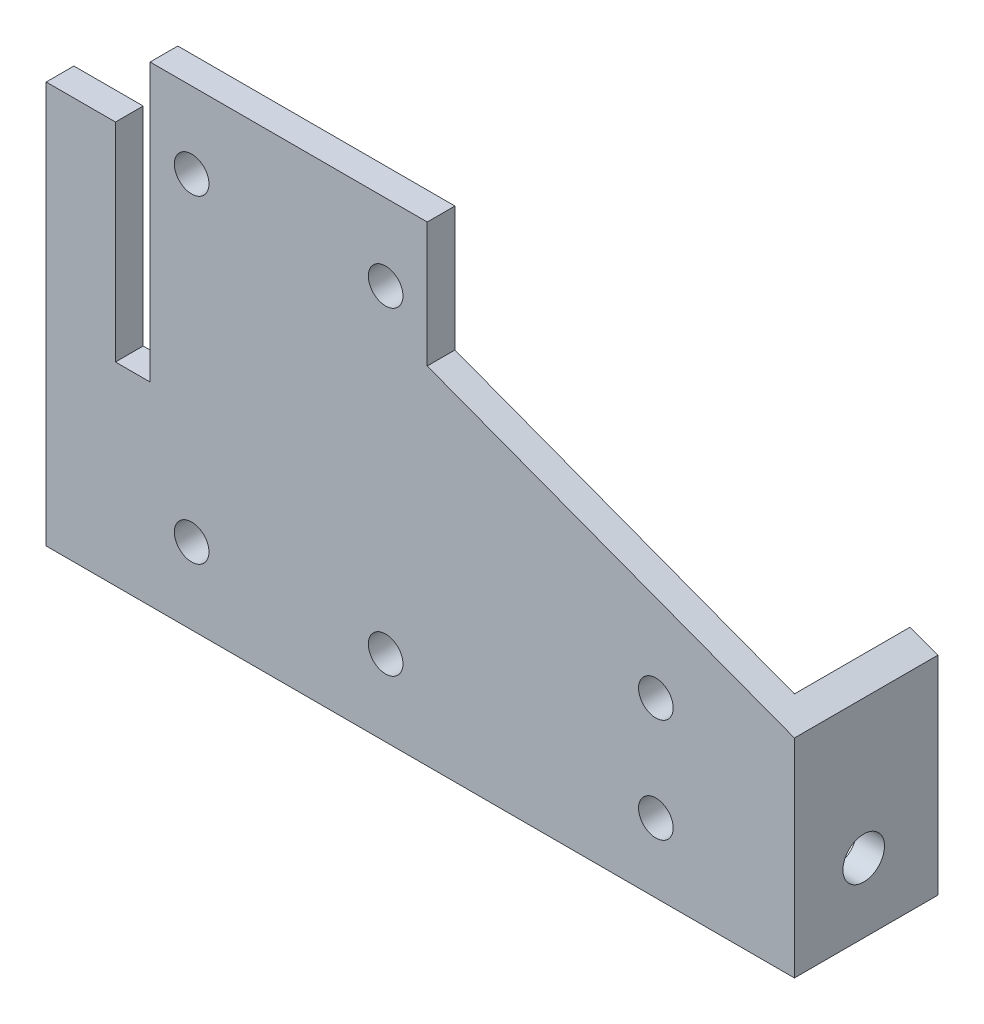
ISO-10303-21;
HEADER;
FILE_DESCRIPTION(('STEP AP214'),'2;1');
FILE_NAME('part.step','',(''),(''),'','','');
FILE_SCHEMA(('AUTOMOTIVE_DESIGN { 1 0 10303 214 1 1 1 1 }'));
ENDSEC;
DATA;
#1=APPLICATION_CONTEXT('core data for automotive mechanical design processes');
#2=APPLICATION_PROTOCOL_DEFINITION('international standard','automotive_design',2000,#1);
#3=PRODUCT_CONTEXT('',#1,'mechanical');
#4=PRODUCT('Part','Part','',(#3));
#5=PRODUCT_RELATED_PRODUCT_CATEGORY('part','',(#4));
#6=PRODUCT_DEFINITION_FORMATION('','',#4);
#7=PRODUCT_DEFINITION_CONTEXT('part definition',#1,'design');
#8=PRODUCT_DEFINITION('design','',#6,#7);
#9=PRODUCT_DEFINITION_SHAPE('','',#8);
#10=(LENGTH_UNIT() NAMED_UNIT(*) SI_UNIT(.MILLI.,.METRE.));
#11=(NAMED_UNIT(*) PLANE_ANGLE_UNIT() SI_UNIT($,.RADIAN.));
#12=(NAMED_UNIT(*) SI_UNIT($,.STERADIAN.) SOLID_ANGLE_UNIT());
#13=UNCERTAINTY_MEASURE_WITH_UNIT(LENGTH_MEASURE(1.E-05),#10,'distance_accuracy_value','');
#14=(GEOMETRIC_REPRESENTATION_CONTEXT(3) GLOBAL_UNCERTAINTY_ASSIGNED_CONTEXT((#13)) GLOBAL_UNIT_ASSIGNED_CONTEXT((#10,
#11,#12)) REPRESENTATION_CONTEXT('',''));
#15=CARTESIAN_POINT('',(0.,0.,0.));
#16=DIRECTION('',(0.,0.,1.));
#17=DIRECTION('',(1.,0.,0.));
#18=AXIS2_PLACEMENT_3D('',#15,#16,#17);
#19=CARTESIAN_POINT('',(0.,0.,4.));
#20=DIRECTION('',(0.,0.,-1.));
#21=DIRECTION('',(-1.,0.,0.));
#22=AXIS2_PLACEMENT_3D('',#19,#20,#21);
#23=PLANE('',#22);
#24=DIRECTION('',(0.,1.,0.));
#25=VECTOR('',#24,1.);
#26=CARTESIAN_POINT('',(9.99999999999999,0.,4.));
#27=LINE('',#26,#25);
#28=CARTESIAN_POINT('',(9.99999999999999,28.,4.));
#29=VERTEX_POINT('',#28);
#30=CARTESIAN_POINT('',(10.,58.,4.));
#31=VERTEX_POINT('',#30);
#32=EDGE_CURVE('E173',#29,#31,#27,.T.);
#33=ORIENTED_EDGE('',*,*,#32,.T.);
#34=DIRECTION('',(-1.,0.,0.));
#35=VECTOR('',#34,1.);
#36=CARTESIAN_POINT('',(0.,58.,4.));
#37=LINE('',#36,#35);
#38=CARTESIAN_POINT('',(0.,58.,4.));
#39=VERTEX_POINT('',#38);
#40=EDGE_CURVE('E279',#31,#39,#37,.T.);
#41=ORIENTED_EDGE('',*,*,#40,.T.);
#42=DIRECTION('',(0.,-1.,0.));
#43=VECTOR('',#42,1.);
#44=CARTESIAN_POINT('',(0.,0.,4.));
#45=LINE('',#44,#43);
#46=CARTESIAN_POINT('',(0.,0.,4.));
#47=VERTEX_POINT('',#46);
#48=EDGE_CURVE('E144',#39,#47,#45,.T.);
#49=ORIENTED_EDGE('',*,*,#48,.T.);
#50=DIRECTION('',(1.,0.,0.));
#51=VECTOR('',#50,1.);
#52=CARTESIAN_POINT('',(0.,0.,4.));
#53=LINE('',#52,#51);
#54=CARTESIAN_POINT('',(108.,0.,4.));
#55=VERTEX_POINT('',#54);
#56=EDGE_CURVE('E147',#47,#55,#53,.T.);
#57=ORIENTED_EDGE('',*,*,#56,.T.);
#58=DIRECTION('',(0.,1.,0.));
#59=VECTOR('',#58,1.);
#60=CARTESIAN_POINT('',(108.,0.,4.));
#61=LINE('',#60,#59);
#62=CARTESIAN_POINT('',(108.,30.,4.));
#63=VERTEX_POINT('',#62);
#64=EDGE_CURVE('E232',#55,#63,#61,.T.);
#65=ORIENTED_EDGE('',*,*,#64,.T.);
#66=DIRECTION('',(-0.935601718950742,0.353057252434242,0.));
#67=VECTOR('',#66,1.);
#68=CARTESIAN_POINT('',(108.,30.,4.));
#69=LINE('',#68,#67);
#70=CARTESIAN_POINT('',(55.,50.,4.));
#71=VERTEX_POINT('',#70);
#72=EDGE_CURVE('E234',#63,#71,#69,.T.);
#73=ORIENTED_EDGE('',*,*,#72,.T.);
#74=DIRECTION('',(0.,1.,0.));
#75=VECTOR('',#74,1.);
#76=CARTESIAN_POINT('',(55.,68.,4.));
#77=LINE('',#76,#75);
#78=CARTESIAN_POINT('',(55.,68.,4.));
#79=VERTEX_POINT('',#78);
#80=EDGE_CURVE('E236',#71,#79,#77,.T.);
#81=ORIENTED_EDGE('',*,*,#80,.T.);
#82=DIRECTION('',(-1.,0.,0.));
#83=VECTOR('',#82,1.);
#84=CARTESIAN_POINT('',(0.,68.,4.));
#85=LINE('',#84,#83);
#86=CARTESIAN_POINT('',(15.,68.,4.));
#87=VERTEX_POINT('',#86);
#88=EDGE_CURVE('E155',#79,#87,#85,.T.);
#89=ORIENTED_EDGE('',*,*,#88,.T.);
#90=DIRECTION('',(0.,-1.,0.));
#91=VECTOR('',#90,1.);
#92=CARTESIAN_POINT('',(15.,0.,4.));
#93=LINE('',#92,#91);
#94=CARTESIAN_POINT('',(15.,28.,4.));
#95=VERTEX_POINT('',#94);
#96=EDGE_CURVE('E49',#87,#95,#93,.T.);
#97=ORIENTED_EDGE('',*,*,#96,.T.);
#98=DIRECTION('',(-1.,0.,0.));
#99=VECTOR('',#98,1.);
#100=CARTESIAN_POINT('',(0.,28.,4.));
#101=LINE('',#100,#99);
#102=EDGE_CURVE('E178',#95,#29,#101,.T.);
#103=ORIENTED_EDGE('',*,*,#102,.T.);
#104=EDGE_LOOP('',(#33,#41,#49,#57,#65,#73,#81,#89,#97,#103));
#105=FACE_BOUND('',#104,.T.);
#106=CARTESIAN_POINT('',(21.,57.,4.));
#107=DIRECTION('',(0.,0.,1.));
#108=DIRECTION('',(1.,0.,0.));
#109=AXIS2_PLACEMENT_3D('',#106,#107,#108);
#110=CIRCLE('',#109,2.5);
#111=CARTESIAN_POINT('',(23.5,57.,4.));
#112=VERTEX_POINT('',#111);
#113=EDGE_CURVE('E225',#112,#112,#110,.T.);
#114=ORIENTED_EDGE('',*,*,#113,.F.);
#115=EDGE_LOOP('',(#114));
#116=FACE_BOUND('',#115,.T.);
#117=CARTESIAN_POINT('',(49.,57.,4.));
#118=DIRECTION('',(0.,0.,1.));
#119=DIRECTION('',(1.,0.,0.));
#120=AXIS2_PLACEMENT_3D('',#117,#118,#119);
#121=CIRCLE('',#120,2.5);
#122=CARTESIAN_POINT('',(51.5,57.,4.));
#123=VERTEX_POINT('',#122);
#124=EDGE_CURVE('E219',#123,#123,#121,.T.);
#125=ORIENTED_EDGE('',*,*,#124,.F.);
#126=EDGE_LOOP('',(#125));
#127=FACE_BOUND('',#126,.T.);
#128=CARTESIAN_POINT('',(21.,11.,4.));
#129=DIRECTION('',(0.,0.,1.));
#130=DIRECTION('',(1.,0.,0.));
#131=AXIS2_PLACEMENT_3D('',#128,#129,#130);
#132=CIRCLE('',#131,2.5);
#133=CARTESIAN_POINT('',(23.5,11.,4.));
#134=VERTEX_POINT('',#133);
#135=EDGE_CURVE('E213',#134,#134,#132,.T.);
#136=ORIENTED_EDGE('',*,*,#135,.F.);
#137=EDGE_LOOP('',(#136));
#138=FACE_BOUND('',#137,.T.);
#139=CARTESIAN_POINT('',(49.,11.,4.));
#140=DIRECTION('',(0.,0.,1.));
#141=DIRECTION('',(1.,0.,0.));
#142=AXIS2_PLACEMENT_3D('',#139,#140,#141);
#143=CIRCLE('',#142,2.5);
#144=CARTESIAN_POINT('',(51.5,11.,4.));
#145=VERTEX_POINT('',#144);
#146=EDGE_CURVE('E207',#145,#145,#143,.T.);
#147=ORIENTED_EDGE('',*,*,#146,.F.);
#148=EDGE_LOOP('',(#147));
#149=FACE_BOUND('',#148,.T.);
#150=CARTESIAN_POINT('',(88.,10.,4.));
#151=DIRECTION('',(0.,0.,1.));
#152=DIRECTION('',(1.,0.,0.));
#153=AXIS2_PLACEMENT_3D('',#150,#151,#152);
#154=CIRCLE('',#153,2.5);
#155=CARTESIAN_POINT('',(90.5,10.,4.));
#156=VERTEX_POINT('',#155);
#157=EDGE_CURVE('E201',#156,#156,#154,.T.);
#158=ORIENTED_EDGE('',*,*,#157,.F.);
#159=EDGE_LOOP('',(#158));
#160=FACE_BOUND('',#159,.T.);
#161=CARTESIAN_POINT('',(88.,25.,4.));
#162=DIRECTION('',(0.,0.,1.));
#163=DIRECTION('',(1.,0.,0.));
#164=AXIS2_PLACEMENT_3D('',#161,#162,#163);
#165=CIRCLE('',#164,2.5);
#166=CARTESIAN_POINT('',(90.5,25.,4.));
#167=VERTEX_POINT('',#166);
#168=EDGE_CURVE('E195',#167,#167,#165,.T.);
#169=ORIENTED_EDGE('',*,*,#168,.F.);
#170=EDGE_LOOP('',(#169));
#171=FACE_BOUND('',#170,.T.);
#172=ADVANCED_FACE('F34',(#105,#116,#127,#138,#149,#160,#171),#23,.F.);
#173=CARTESIAN_POINT('',(0.,0.,0.));
#174=DIRECTION('',(0.,0.,-1.));
#175=DIRECTION('',(-1.,0.,0.));
#176=AXIS2_PLACEMENT_3D('',#173,#174,#175);
#177=PLANE('',#176);
#178=DIRECTION('',(-1.,0.,0.));
#179=VECTOR('',#178,1.);
#180=CARTESIAN_POINT('',(0.,58.,0.));
#181=LINE('',#180,#179);
#182=CARTESIAN_POINT('',(10.,58.,0.));
#183=VERTEX_POINT('',#182);
#184=CARTESIAN_POINT('',(0.,58.,0.));
#185=VERTEX_POINT('',#184);
#186=EDGE_CURVE('E284',#183,#185,#181,.T.);
#187=ORIENTED_EDGE('',*,*,#186,.F.);
#188=DIRECTION('',(0.,1.,0.));
#189=VECTOR('',#188,1.);
#190=CARTESIAN_POINT('',(10.,58.,0.));
#191=LINE('',#190,#189);
#192=CARTESIAN_POINT('',(9.99999999999999,28.,0.));
#193=VERTEX_POINT('',#192);
#194=EDGE_CURVE('E298',#193,#183,#191,.T.);
#195=ORIENTED_EDGE('',*,*,#194,.F.);
#196=DIRECTION('',(-1.,0.,0.));
#197=VECTOR('',#196,1.);
#198=CARTESIAN_POINT('',(15.,28.,0.));
#199=LINE('',#198,#197);
#200=CARTESIAN_POINT('',(15.,28.,0.));
#201=VERTEX_POINT('',#200);
#202=EDGE_CURVE('E138',#201,#193,#199,.T.);
#203=ORIENTED_EDGE('',*,*,#202,.F.);
#204=DIRECTION('',(0.,-1.,0.));
#205=VECTOR('',#204,1.);
#206=CARTESIAN_POINT('',(15.,48.,0.));
#207=LINE('',#206,#205);
#208=CARTESIAN_POINT('',(15.,68.,0.));
#209=VERTEX_POINT('',#208);
#210=EDGE_CURVE('E123',#209,#201,#207,.T.);
#211=ORIENTED_EDGE('',*,*,#210,.F.);
#212=DIRECTION('',(-1.,0.,0.));
#213=VECTOR('',#212,1.);
#214=CARTESIAN_POINT('',(0.,68.,0.));
#215=LINE('',#214,#213);
#216=CARTESIAN_POINT('',(55.,68.,0.));
#217=VERTEX_POINT('',#216);
#218=EDGE_CURVE('E135',#217,#209,#215,.T.);
#219=ORIENTED_EDGE('',*,*,#218,.F.);
#220=DIRECTION('',(0.,1.,0.));
#221=VECTOR('',#220,1.);
#222=CARTESIAN_POINT('',(55.,68.,0.));
#223=LINE('',#222,#221);
#224=CARTESIAN_POINT('',(55.,50.,0.));
#225=VERTEX_POINT('',#224);
#226=EDGE_CURVE('E145',#225,#217,#223,.T.);
#227=ORIENTED_EDGE('',*,*,#226,.F.);
#228=DIRECTION('',(-0.935601718950742,0.353057252434242,0.));
#229=VECTOR('',#228,1.);
#230=CARTESIAN_POINT('',(108.,30.,0.));
#231=LINE('',#230,#229);
#232=CARTESIAN_POINT('',(104.,31.5094339622642,0.));
#233=VERTEX_POINT('',#232);
#234=EDGE_CURVE('E149',#233,#225,#231,.T.);
#235=ORIENTED_EDGE('',*,*,#234,.F.);
#236=DIRECTION('',(0.,1.,0.));
#237=VECTOR('',#236,1.);
#238=CARTESIAN_POINT('',(104.,0.,0.));
#239=LINE('',#238,#237);
#240=CARTESIAN_POINT('',(104.,0.,0.));
#241=VERTEX_POINT('',#240);
#242=EDGE_CURVE('E191',#241,#233,#239,.T.);
#243=ORIENTED_EDGE('',*,*,#242,.F.);
#244=DIRECTION('',(1.,0.,0.));
#245=VECTOR('',#244,1.);
#246=CARTESIAN_POINT('',(0.,0.,0.));
#247=LINE('',#246,#245);
#248=CARTESIAN_POINT('',(0.,0.,0.));
#249=VERTEX_POINT('',#248);
#250=EDGE_CURVE('E240',#249,#241,#247,.T.);
#251=ORIENTED_EDGE('',*,*,#250,.F.);
#252=DIRECTION('',(0.,-1.,0.));
#253=VECTOR('',#252,1.);
#254=CARTESIAN_POINT('',(0.,0.,0.));
#255=LINE('',#254,#253);
#256=EDGE_CURVE('E228',#185,#249,#255,.T.);
#257=ORIENTED_EDGE('',*,*,#256,.F.);
#258=EDGE_LOOP('',(#187,#195,#203,#211,#219,#227,#235,#243,#251,#257));
#259=FACE_BOUND('',#258,.T.);
#260=CARTESIAN_POINT('',(88.,10.,0.));
#261=DIRECTION('',(0.,0.,1.));
#262=DIRECTION('',(1.,0.,0.));
#263=AXIS2_PLACEMENT_3D('',#260,#261,#262);
#264=CIRCLE('',#263,2.5);
#265=CARTESIAN_POINT('',(90.5,10.,0.));
#266=VERTEX_POINT('',#265);
#267=EDGE_CURVE('E198',#266,#266,#264,.T.);
#268=ORIENTED_EDGE('',*,*,#267,.T.);
#269=EDGE_LOOP('',(#268));
#270=FACE_BOUND('',#269,.T.);
#271=CARTESIAN_POINT('',(21.,11.,0.));
#272=DIRECTION('',(0.,0.,1.));
#273=DIRECTION('',(1.,0.,0.));
#274=AXIS2_PLACEMENT_3D('',#271,#272,#273);
#275=CIRCLE('',#274,2.5);
#276=CARTESIAN_POINT('',(23.5,11.,0.));
#277=VERTEX_POINT('',#276);
#278=EDGE_CURVE('E210',#277,#277,#275,.T.);
#279=ORIENTED_EDGE('',*,*,#278,.T.);
#280=EDGE_LOOP('',(#279));
#281=FACE_BOUND('',#280,.T.);
#282=CARTESIAN_POINT('',(21.,57.,0.));
#283=DIRECTION('',(0.,0.,1.));
#284=DIRECTION('',(1.,0.,0.));
#285=AXIS2_PLACEMENT_3D('',#282,#283,#284);
#286=CIRCLE('',#285,2.5);
#287=CARTESIAN_POINT('',(23.5,57.,0.));
#288=VERTEX_POINT('',#287);
#289=EDGE_CURVE('E222',#288,#288,#286,.T.);
#290=ORIENTED_EDGE('',*,*,#289,.T.);
#291=EDGE_LOOP('',(#290));
#292=FACE_BOUND('',#291,.T.);
#293=CARTESIAN_POINT('',(49.,57.,0.));
#294=DIRECTION('',(0.,0.,1.));
#295=DIRECTION('',(1.,0.,0.));
#296=AXIS2_PLACEMENT_3D('',#293,#294,#295);
#297=CIRCLE('',#296,2.5);
#298=CARTESIAN_POINT('',(51.5,57.,0.));
#299=VERTEX_POINT('',#298);
#300=EDGE_CURVE('E216',#299,#299,#297,.T.);
#301=ORIENTED_EDGE('',*,*,#300,.T.);
#302=EDGE_LOOP('',(#301));
#303=FACE_BOUND('',#302,.T.);
#304=CARTESIAN_POINT('',(49.,11.,0.));
#305=DIRECTION('',(0.,0.,1.));
#306=DIRECTION('',(1.,0.,0.));
#307=AXIS2_PLACEMENT_3D('',#304,#305,#306);
#308=CIRCLE('',#307,2.5);
#309=CARTESIAN_POINT('',(51.5,11.,0.));
#310=VERTEX_POINT('',#309);
#311=EDGE_CURVE('E204',#310,#310,#308,.T.);
#312=ORIENTED_EDGE('',*,*,#311,.T.);
#313=EDGE_LOOP('',(#312));
#314=FACE_BOUND('',#313,.T.);
#315=CARTESIAN_POINT('',(88.,25.,0.));
#316=DIRECTION('',(0.,0.,1.));
#317=DIRECTION('',(1.,0.,0.));
#318=AXIS2_PLACEMENT_3D('',#315,#316,#317);
#319=CIRCLE('',#318,2.5);
#320=CARTESIAN_POINT('',(90.5,25.,0.));
#321=VERTEX_POINT('',#320);
#322=EDGE_CURVE('E194',#321,#321,#319,.T.);
#323=ORIENTED_EDGE('',*,*,#322,.T.);
#324=EDGE_LOOP('',(#323));
#325=FACE_BOUND('',#324,.T.);
#326=ADVANCED_FACE('F132',(#259,#270,#281,#292,#303,#314,#325),#177,.T.);
#327=CARTESIAN_POINT('',(0.,0.,4.));
#328=DIRECTION('',(1.,0.,0.));
#329=DIRECTION('',(0.,0.,-1.));
#330=AXIS2_PLACEMENT_3D('',#327,#328,#329);
#331=PLANE('',#330);
#332=ORIENTED_EDGE('',*,*,#48,.F.);
#333=DIRECTION('',(0.,0.,-1.));
#334=VECTOR('',#333,1.);
#335=CARTESIAN_POINT('',(0.,58.,10.));
#336=LINE('',#335,#334);
#337=EDGE_CURVE('E274',#39,#185,#336,.T.);
#338=ORIENTED_EDGE('',*,*,#337,.T.);
#339=ORIENTED_EDGE('',*,*,#256,.T.);
#340=DIRECTION('',(0.,0.,-1.));
#341=VECTOR('',#340,1.);
#342=CARTESIAN_POINT('',(0.,0.,4.));
#343=LINE('',#342,#341);
#344=EDGE_CURVE('E42',#47,#249,#343,.T.);
#345=ORIENTED_EDGE('',*,*,#344,.F.);
#346=EDGE_LOOP('',(#332,#338,#339,#345));
#347=FACE_BOUND('',#346,.T.);
#348=ADVANCED_FACE('F36',(#347),#331,.F.);
#349=CARTESIAN_POINT('',(0.,0.,4.));
#350=DIRECTION('',(0.,1.,0.));
#351=DIRECTION('',(0.,0.,1.));
#352=AXIS2_PLACEMENT_3D('',#349,#350,#351);
#353=PLANE('',#352);
#354=ORIENTED_EDGE('',*,*,#250,.T.);
#355=DIRECTION('',(0.,0.,1.));
#356=VECTOR('',#355,1.);
#357=CARTESIAN_POINT('',(104.,0.,-16.7));
#358=LINE('',#357,#356);
#359=CARTESIAN_POINT('',(104.,0.,-16.7));
#360=VERTEX_POINT('',#359);
#361=EDGE_CURVE('E189',#360,#241,#358,.T.);
#362=ORIENTED_EDGE('',*,*,#361,.F.);
#363=DIRECTION('',(1.,0.,0.));
#364=VECTOR('',#363,1.);
#365=CARTESIAN_POINT('',(108.,0.,-16.7));
#366=LINE('',#365,#364);
#367=CARTESIAN_POINT('',(108.,0.,-16.7));
#368=VERTEX_POINT('',#367);
#369=EDGE_CURVE('E186',#360,#368,#366,.T.);
#370=ORIENTED_EDGE('',*,*,#369,.T.);
#371=DIRECTION('',(0.,0.,-1.));
#372=VECTOR('',#371,1.);
#373=CARTESIAN_POINT('',(108.,0.,4.));
#374=LINE('',#373,#372);
#375=EDGE_CURVE('E160',#55,#368,#374,.T.);
#376=ORIENTED_EDGE('',*,*,#375,.F.);
#377=ORIENTED_EDGE('',*,*,#56,.F.);
#378=ORIENTED_EDGE('',*,*,#344,.T.);
#379=EDGE_LOOP('',(#354,#362,#370,#376,#377,#378));
#380=FACE_BOUND('',#379,.T.);
#381=ADVANCED_FACE('F265',(#380),#353,.F.);
#382=CARTESIAN_POINT('',(108.,0.,4.));
#383=DIRECTION('',(-1.,0.,0.));
#384=DIRECTION('',(0.,0.,1.));
#385=AXIS2_PLACEMENT_3D('',#382,#383,#384);
#386=PLANE('',#385);
#387=CARTESIAN_POINT('',(108.,10.,-6.));
#388=DIRECTION('',(1.,0.,0.));
#389=DIRECTION('',(0.,0.,-1.));
#390=AXIS2_PLACEMENT_3D('',#387,#388,#389);
#391=CIRCLE('',#390,3.);
#392=CARTESIAN_POINT('',(108.,10.,-9.));
#393=VERTEX_POINT('',#392);
#394=EDGE_CURVE('E166',#393,#393,#391,.T.);
#395=ORIENTED_EDGE('',*,*,#394,.F.);
#396=EDGE_LOOP('',(#395));
#397=FACE_BOUND('',#396,.T.);
#398=ORIENTED_EDGE('',*,*,#375,.T.);
#399=DIRECTION('',(0.,1.,0.));
#400=VECTOR('',#399,1.);
#401=CARTESIAN_POINT('',(108.,30.,-16.7));
#402=LINE('',#401,#400);
#403=CARTESIAN_POINT('',(108.,30.,-16.7));
#404=VERTEX_POINT('',#403);
#405=EDGE_CURVE('E165',#368,#404,#402,.T.);
#406=ORIENTED_EDGE('',*,*,#405,.T.);
#407=DIRECTION('',(0.,0.,-1.));
#408=VECTOR('',#407,1.);
#409=CARTESIAN_POINT('',(108.,30.,4.));
#410=LINE('',#409,#408);
#411=EDGE_CURVE('E158',#63,#404,#410,.T.);
#412=ORIENTED_EDGE('',*,*,#411,.F.);
#413=ORIENTED_EDGE('',*,*,#64,.F.);
#414=EDGE_LOOP('',(#398,#406,#412,#413));
#415=FACE_BOUND('',#414,.T.);
#416=ADVANCED_FACE('F261',(#397,#415),#386,.F.);
#417=CARTESIAN_POINT('',(108.,30.,4.));
#418=DIRECTION('',(-0.353057252434242,-0.935601718950742,0.));
#419=DIRECTION('',(0.935601718950742,-0.353057252434242,0.));
#420=AXIS2_PLACEMENT_3D('',#417,#418,#419);
#421=PLANE('',#420);
#422=DIRECTION('',(0.,0.,-1.));
#423=VECTOR('',#422,1.);
#424=CARTESIAN_POINT('',(55.,50.,4.));
#425=LINE('',#424,#423);
#426=EDGE_CURVE('E154',#71,#225,#425,.T.);
#427=ORIENTED_EDGE('',*,*,#426,.F.);
#428=ORIENTED_EDGE('',*,*,#72,.F.);
#429=ORIENTED_EDGE('',*,*,#411,.T.);
#430=DIRECTION('',(-0.935601718950742,0.353057252434242,0.));
#431=VECTOR('',#430,1.);
#432=CARTESIAN_POINT('',(104.,31.5094339622642,-16.7));
#433=LINE('',#432,#431);
#434=CARTESIAN_POINT('',(104.,31.5094339622642,-16.7));
#435=VERTEX_POINT('',#434);
#436=EDGE_CURVE('E170',#404,#435,#433,.T.);
#437=ORIENTED_EDGE('',*,*,#436,.T.);
#438=DIRECTION('',(0.,0.,1.));
#439=VECTOR('',#438,1.);
#440=CARTESIAN_POINT('',(104.,31.5094339622642,-16.7));
#441=LINE('',#440,#439);
#442=EDGE_CURVE('E56',#435,#233,#441,.T.);
#443=ORIENTED_EDGE('',*,*,#442,.T.);
#444=ORIENTED_EDGE('',*,*,#234,.T.);
#445=EDGE_LOOP('',(#427,#428,#429,#437,#443,#444));
#446=FACE_BOUND('',#445,.T.);
#447=ADVANCED_FACE('F244',(#446),#421,.F.);
#448=CARTESIAN_POINT('',(55.,68.,4.));
#449=DIRECTION('',(-1.,0.,0.));
#450=DIRECTION('',(0.,-1.,0.));
#451=AXIS2_PLACEMENT_3D('',#448,#449,#450);
#452=PLANE('',#451);
#453=ORIENTED_EDGE('',*,*,#226,.T.);
#454=DIRECTION('',(0.,0.,-1.));
#455=VECTOR('',#454,1.);
#456=CARTESIAN_POINT('',(55.,68.,4.));
#457=LINE('',#456,#455);
#458=EDGE_CURVE('E143',#79,#217,#457,.T.);
#459=ORIENTED_EDGE('',*,*,#458,.F.);
#460=ORIENTED_EDGE('',*,*,#80,.F.);
#461=ORIENTED_EDGE('',*,*,#426,.T.);
#462=EDGE_LOOP('',(#453,#459,#460,#461));
#463=FACE_BOUND('',#462,.T.);
#464=ADVANCED_FACE('F249',(#463),#452,.F.);
#465=CARTESIAN_POINT('',(0.,68.,4.));
#466=DIRECTION('',(0.,-1.,0.));
#467=DIRECTION('',(0.,0.,-1.));
#468=AXIS2_PLACEMENT_3D('',#465,#466,#467);
#469=PLANE('',#468);
#470=ORIENTED_EDGE('',*,*,#218,.T.);
#471=DIRECTION('',(0.,0.,1.));
#472=VECTOR('',#471,1.);
#473=CARTESIAN_POINT('',(15.,68.,4.));
#474=LINE('',#473,#472);
#475=EDGE_CURVE('E11',#209,#87,#474,.T.);
#476=ORIENTED_EDGE('',*,*,#475,.T.);
#477=ORIENTED_EDGE('',*,*,#88,.F.);
#478=ORIENTED_EDGE('',*,*,#458,.T.);
#479=EDGE_LOOP('',(#470,#476,#477,#478));
#480=FACE_BOUND('',#479,.T.);
#481=ADVANCED_FACE('F141',(#480),#469,.F.);
#482=CARTESIAN_POINT('',(21.,57.,4.));
#483=DIRECTION('',(0.,0.,-1.));
#484=DIRECTION('',(-1.,0.,0.));
#485=AXIS2_PLACEMENT_3D('',#482,#483,#484);
#486=CYLINDRICAL_SURFACE('',#485,2.5);
#487=ORIENTED_EDGE('',*,*,#113,.T.);
#488=EDGE_LOOP('',(#487));
#489=FACE_BOUND('',#488,.T.);
#490=ORIENTED_EDGE('',*,*,#289,.F.);
#491=EDGE_LOOP('',(#490));
#492=FACE_BOUND('',#491,.T.);
#493=ADVANCED_FACE('F317',(#489,#492),#486,.F.);
#494=CARTESIAN_POINT('',(49.,57.,4.));
#495=DIRECTION('',(0.,0.,-1.));
#496=DIRECTION('',(-1.,0.,0.));
#497=AXIS2_PLACEMENT_3D('',#494,#495,#496);
#498=CYLINDRICAL_SURFACE('',#497,2.5);
#499=ORIENTED_EDGE('',*,*,#124,.T.);
#500=EDGE_LOOP('',(#499));
#501=FACE_BOUND('',#500,.T.);
#502=ORIENTED_EDGE('',*,*,#300,.F.);
#503=EDGE_LOOP('',(#502));
#504=FACE_BOUND('',#503,.T.);
#505=ADVANCED_FACE('F430',(#501,#504),#498,.F.);
#506=CARTESIAN_POINT('',(21.,11.,4.));
#507=DIRECTION('',(0.,0.,-1.));
#508=DIRECTION('',(-1.,0.,0.));
#509=AXIS2_PLACEMENT_3D('',#506,#507,#508);
#510=CYLINDRICAL_SURFACE('',#509,2.5);
#511=ORIENTED_EDGE('',*,*,#135,.T.);
#512=EDGE_LOOP('',(#511));
#513=FACE_BOUND('',#512,.T.);
#514=ORIENTED_EDGE('',*,*,#278,.F.);
#515=EDGE_LOOP('',(#514));
#516=FACE_BOUND('',#515,.T.);
#517=ADVANCED_FACE('F420',(#513,#516),#510,.F.);
#518=CARTESIAN_POINT('',(49.,11.,4.));
#519=DIRECTION('',(0.,0.,-1.));
#520=DIRECTION('',(-1.,0.,0.));
#521=AXIS2_PLACEMENT_3D('',#518,#519,#520);
#522=CYLINDRICAL_SURFACE('',#521,2.5);
#523=ORIENTED_EDGE('',*,*,#146,.T.);
#524=EDGE_LOOP('',(#523));
#525=FACE_BOUND('',#524,.T.);
#526=ORIENTED_EDGE('',*,*,#311,.F.);
#527=EDGE_LOOP('',(#526));
#528=FACE_BOUND('',#527,.T.);
#529=ADVANCED_FACE('F410',(#525,#528),#522,.F.);
#530=CARTESIAN_POINT('',(88.,10.,4.));
#531=DIRECTION('',(0.,0.,-1.));
#532=DIRECTION('',(-1.,0.,0.));
#533=AXIS2_PLACEMENT_3D('',#530,#531,#532);
#534=CYLINDRICAL_SURFACE('',#533,2.5);
#535=ORIENTED_EDGE('',*,*,#157,.T.);
#536=EDGE_LOOP('',(#535));
#537=FACE_BOUND('',#536,.T.);
#538=ORIENTED_EDGE('',*,*,#267,.F.);
#539=EDGE_LOOP('',(#538));
#540=FACE_BOUND('',#539,.T.);
#541=ADVANCED_FACE('F400',(#537,#540),#534,.F.);
#542=CARTESIAN_POINT('',(88.,25.,4.));
#543=DIRECTION('',(0.,0.,-1.));
#544=DIRECTION('',(-1.,0.,0.));
#545=AXIS2_PLACEMENT_3D('',#542,#543,#544);
#546=CYLINDRICAL_SURFACE('',#545,2.5);
#547=ORIENTED_EDGE('',*,*,#168,.T.);
#548=EDGE_LOOP('',(#547));
#549=FACE_BOUND('',#548,.T.);
#550=ORIENTED_EDGE('',*,*,#322,.F.);
#551=EDGE_LOOP('',(#550));
#552=FACE_BOUND('',#551,.T.);
#553=ADVANCED_FACE('F365',(#549,#552),#546,.F.);
#554=CARTESIAN_POINT('',(104.,0.,-16.7));
#555=DIRECTION('',(-1.,0.,0.));
#556=DIRECTION('',(0.,0.,1.));
#557=AXIS2_PLACEMENT_3D('',#554,#555,#556);
#558=PLANE('',#557);
#559=CARTESIAN_POINT('',(104.,10.,-6.));
#560=DIRECTION('',(-1.,0.,0.));
#561=DIRECTION('',(0.,0.,1.));
#562=AXIS2_PLACEMENT_3D('',#559,#560,#561);
#563=CIRCLE('',#562,3.);
#564=CARTESIAN_POINT('',(104.,10.,-3.));
#565=VERTEX_POINT('',#564);
#566=EDGE_CURVE('E163',#565,#565,#563,.T.);
#567=ORIENTED_EDGE('',*,*,#566,.F.);
#568=EDGE_LOOP('',(#567));
#569=FACE_BOUND('',#568,.T.);
#570=ORIENTED_EDGE('',*,*,#361,.T.);
#571=ORIENTED_EDGE('',*,*,#242,.T.);
#572=ORIENTED_EDGE('',*,*,#442,.F.);
#573=DIRECTION('',(0.,-1.,0.));
#574=VECTOR('',#573,1.);
#575=CARTESIAN_POINT('',(104.,0.,-16.7));
#576=LINE('',#575,#574);
#577=EDGE_CURVE('E183',#435,#360,#576,.T.);
#578=ORIENTED_EDGE('',*,*,#577,.T.);
#579=EDGE_LOOP('',(#570,#571,#572,#578));
#580=FACE_BOUND('',#579,.T.);
#581=ADVANCED_FACE('F269',(#569,#580),#558,.T.);
#582=CARTESIAN_POINT('',(0.,0.,-16.7));
#583=DIRECTION('',(0.,0.,-1.));
#584=DIRECTION('',(-1.,0.,0.));
#585=AXIS2_PLACEMENT_3D('',#582,#583,#584);
#586=PLANE('',#585);
#587=ORIENTED_EDGE('',*,*,#405,.F.);
#588=ORIENTED_EDGE('',*,*,#369,.F.);
#589=ORIENTED_EDGE('',*,*,#577,.F.);
#590=ORIENTED_EDGE('',*,*,#436,.F.);
#591=EDGE_LOOP('',(#587,#588,#589,#590));
#592=FACE_BOUND('',#591,.T.);
#593=ADVANCED_FACE('F259',(#592),#586,.T.);
#594=CARTESIAN_POINT('',(101.3,10.,-6.));
#595=DIRECTION('',(1.,0.,0.));
#596=DIRECTION('',(0.,0.,-1.));
#597=AXIS2_PLACEMENT_3D('',#594,#595,#596);
#598=CYLINDRICAL_SURFACE('',#597,3.);
#599=ORIENTED_EDGE('',*,*,#566,.T.);
#600=EDGE_LOOP('',(#599));
#601=FACE_BOUND('',#600,.T.);
#602=ORIENTED_EDGE('',*,*,#394,.T.);
#603=EDGE_LOOP('',(#602));
#604=FACE_BOUND('',#603,.T.);
#605=ADVANCED_FACE('F348',(#601,#604),#598,.F.);
#606=CARTESIAN_POINT('',(10.,58.,10.));
#607=DIRECTION('',(-1.,0.,0.));
#608=DIRECTION('',(0.,-1.,0.));
#609=AXIS2_PLACEMENT_3D('',#606,#607,#608);
#610=PLANE('',#609);
#611=DIRECTION('',(0.,0.,-1.));
#612=VECTOR('',#611,1.);
#613=CARTESIAN_POINT('',(9.99999999999999,28.,10.));
#614=LINE('',#613,#612);
#615=EDGE_CURVE('E281',#29,#193,#614,.T.);
#616=ORIENTED_EDGE('',*,*,#615,.T.);
#617=ORIENTED_EDGE('',*,*,#194,.T.);
#618=DIRECTION('',(0.,0.,-1.));
#619=VECTOR('',#618,1.);
#620=CARTESIAN_POINT('',(10.,58.,10.));
#621=LINE('',#620,#619);
#622=EDGE_CURVE('E277',#31,#183,#621,.T.);
#623=ORIENTED_EDGE('',*,*,#622,.F.);
#624=ORIENTED_EDGE('',*,*,#32,.F.);
#625=EDGE_LOOP('',(#616,#617,#623,#624));
#626=FACE_BOUND('',#625,.T.);
#627=ADVANCED_FACE('F296',(#626),#610,.F.);
#628=CARTESIAN_POINT('',(15.,28.,10.));
#629=DIRECTION('',(0.,-1.,0.));
#630=DIRECTION('',(1.,0.,0.));
#631=AXIS2_PLACEMENT_3D('',#628,#629,#630);
#632=PLANE('',#631);
#633=DIRECTION('',(0.,0.,-1.));
#634=VECTOR('',#633,1.);
#635=CARTESIAN_POINT('',(15.,28.,10.));
#636=LINE('',#635,#634);
#637=EDGE_CURVE('E288',#95,#201,#636,.T.);
#638=ORIENTED_EDGE('',*,*,#637,.T.);
#639=ORIENTED_EDGE('',*,*,#202,.T.);
#640=ORIENTED_EDGE('',*,*,#615,.F.);
#641=ORIENTED_EDGE('',*,*,#102,.F.);
#642=EDGE_LOOP('',(#638,#639,#640,#641));
#643=FACE_BOUND('',#642,.T.);
#644=ADVANCED_FACE('F293',(#643),#632,.F.);
#645=CARTESIAN_POINT('',(0.,58.,10.));
#646=DIRECTION('',(0.,-1.,0.));
#647=DIRECTION('',(0.,0.,-1.));
#648=AXIS2_PLACEMENT_3D('',#645,#646,#647);
#649=PLANE('',#648);
#650=ORIENTED_EDGE('',*,*,#622,.T.);
#651=ORIENTED_EDGE('',*,*,#186,.T.);
#652=ORIENTED_EDGE('',*,*,#337,.F.);
#653=ORIENTED_EDGE('',*,*,#40,.F.);
#654=EDGE_LOOP('',(#650,#651,#652,#653));
#655=FACE_BOUND('',#654,.T.);
#656=ADVANCED_FACE('F299',(#655),#649,.F.);
#657=CARTESIAN_POINT('',(15.,48.,10.));
#658=DIRECTION('',(1.,0.,0.));
#659=DIRECTION('',(0.,1.,0.));
#660=AXIS2_PLACEMENT_3D('',#657,#658,#659);
#661=PLANE('',#660);
#662=ORIENTED_EDGE('',*,*,#475,.F.);
#663=ORIENTED_EDGE('',*,*,#210,.T.);
#664=ORIENTED_EDGE('',*,*,#637,.F.);
#665=ORIENTED_EDGE('',*,*,#96,.F.);
#666=EDGE_LOOP('',(#662,#663,#664,#665));
#667=FACE_BOUND('',#666,.T.);
#668=ADVANCED_FACE('F122',(#667),#661,.F.);
#669=CLOSED_SHELL('',(#172,#326,#348,#381,#416,#447,#464,#481,#493,#505,#517,#529,#541,#553,
#581,#593,#605,#627,#644,#656,#668));
#670=MANIFOLD_SOLID_BREP('B2',#669);
#671=ADVANCED_BREP_SHAPE_REPRESENTATION('',(#18,#670),#14);
#672=SHAPE_DEFINITION_REPRESENTATION(#9,#671);
ENDSEC;
END-ISO-10303-21;
